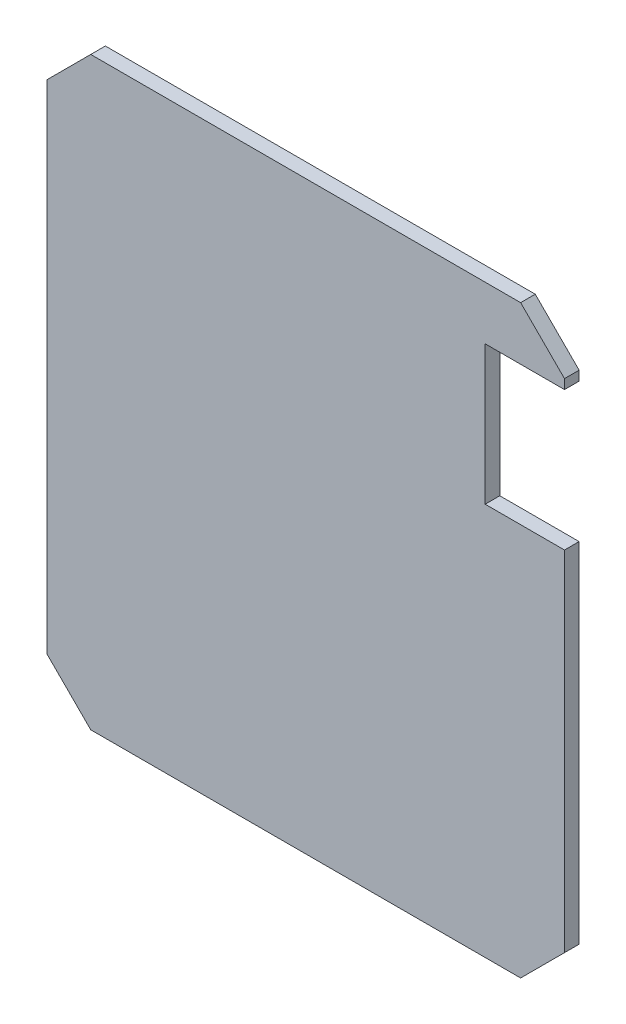
ISO-10303-21;
HEADER;
FILE_DESCRIPTION(('STEP AP214'),'2;1');
FILE_NAME('part.step','',(''),(''),'','','');
FILE_SCHEMA(('AUTOMOTIVE_DESIGN { 1 0 10303 214 1 1 1 1 }'));
ENDSEC;
DATA;
#1=APPLICATION_CONTEXT('core data for automotive mechanical design processes');
#2=APPLICATION_PROTOCOL_DEFINITION('international standard','automotive_design',2000,#1);
#3=PRODUCT_CONTEXT('',#1,'mechanical');
#4=PRODUCT('Part','Part','',(#3));
#5=PRODUCT_RELATED_PRODUCT_CATEGORY('part','',(#4));
#6=PRODUCT_DEFINITION_FORMATION('','',#4);
#7=PRODUCT_DEFINITION_CONTEXT('part definition',#1,'design');
#8=PRODUCT_DEFINITION('design','',#6,#7);
#9=PRODUCT_DEFINITION_SHAPE('','',#8);
#10=(LENGTH_UNIT() NAMED_UNIT(*) SI_UNIT(.MILLI.,.METRE.));
#11=(NAMED_UNIT(*) PLANE_ANGLE_UNIT() SI_UNIT($,.RADIAN.));
#12=(NAMED_UNIT(*) SI_UNIT($,.STERADIAN.) SOLID_ANGLE_UNIT());
#13=UNCERTAINTY_MEASURE_WITH_UNIT(LENGTH_MEASURE(1.E-05),#10,'distance_accuracy_value','');
#14=(GEOMETRIC_REPRESENTATION_CONTEXT(3) GLOBAL_UNCERTAINTY_ASSIGNED_CONTEXT((#13)) GLOBAL_UNIT_ASSIGNED_CONTEXT((#10,
#11,#12)) REPRESENTATION_CONTEXT('',''));
#15=CARTESIAN_POINT('',(0.,0.,0.));
#16=DIRECTION('',(0.,0.,1.));
#17=DIRECTION('',(1.,0.,0.));
#18=AXIS2_PLACEMENT_3D('',#15,#16,#17);
#19=CARTESIAN_POINT('',(17.7,17.,1.));
#20=DIRECTION('',(1.,0.,0.));
#21=DIRECTION('',(0.,0.,-1.));
#22=AXIS2_PLACEMENT_3D('',#19,#20,#21);
#23=PLANE('',#22);
#24=DIRECTION('',(0.,0.,1.));
#25=VECTOR('',#24,1.);
#26=CARTESIAN_POINT('',(17.7,6.84902346383944,0.));
#27=LINE('',#26,#25);
#28=CARTESIAN_POINT('',(17.7,6.84902346383944,0.));
#29=VERTEX_POINT('',#28);
#30=CARTESIAN_POINT('',(17.7,6.84902346383944,1.));
#31=VERTEX_POINT('',#30);
#32=EDGE_CURVE('E150',#29,#31,#27,.T.);
#33=ORIENTED_EDGE('',*,*,#32,.T.);
#34=DIRECTION('',(0.,-1.,0.));
#35=VECTOR('',#34,1.);
#36=CARTESIAN_POINT('',(17.7,17.,1.));
#37=LINE('',#36,#35);
#38=CARTESIAN_POINT('',(17.7,-17.,1.));
#39=VERTEX_POINT('',#38);
#40=EDGE_CURVE('E192',#31,#39,#37,.T.);
#41=ORIENTED_EDGE('',*,*,#40,.T.);
#42=DIRECTION('',(0.,0.,-1.));
#43=VECTOR('',#42,1.);
#44=CARTESIAN_POINT('',(17.7,-17.,1.));
#45=LINE('',#44,#43);
#46=CARTESIAN_POINT('',(17.7,-17.,0.));
#47=VERTEX_POINT('',#46);
#48=EDGE_CURVE('E171',#39,#47,#45,.T.);
#49=ORIENTED_EDGE('',*,*,#48,.T.);
#50=DIRECTION('',(0.,-1.,0.));
#51=VECTOR('',#50,1.);
#52=CARTESIAN_POINT('',(17.7,17.,0.));
#53=LINE('',#52,#51);
#54=EDGE_CURVE('E156',#29,#47,#53,.T.);
#55=ORIENTED_EDGE('',*,*,#54,.F.);
#56=EDGE_LOOP('',(#33,#41,#49,#55));
#57=FACE_BOUND('',#56,.T.);
#58=ADVANCED_FACE('F33',(#57),#23,.T.);
#59=CARTESIAN_POINT('',(-17.7,17.,1.));
#60=DIRECTION('',(-0.707106781186547,0.707106781186547,0.));
#61=DIRECTION('',(-0.707106781186548,-0.707106781186548,0.));
#62=AXIS2_PLACEMENT_3D('',#59,#60,#61);
#63=PLANE('',#62);
#64=DIRECTION('',(0.707106781186548,0.707106781186548,0.));
#65=VECTOR('',#64,1.);
#66=CARTESIAN_POINT('',(-17.7,17.,0.));
#67=LINE('',#66,#65);
#68=CARTESIAN_POINT('',(-17.7,17.,0.));
#69=VERTEX_POINT('',#68);
#70=CARTESIAN_POINT('',(-14.7,20.,0.));
#71=VERTEX_POINT('',#70);
#72=EDGE_CURVE('E146',#69,#71,#67,.T.);
#73=ORIENTED_EDGE('',*,*,#72,.F.);
#74=DIRECTION('',(0.,0.,-1.));
#75=VECTOR('',#74,1.);
#76=CARTESIAN_POINT('',(-17.7,17.,1.));
#77=LINE('',#76,#75);
#78=CARTESIAN_POINT('',(-17.7,17.,1.));
#79=VERTEX_POINT('',#78);
#80=EDGE_CURVE('E11',#79,#69,#77,.T.);
#81=ORIENTED_EDGE('',*,*,#80,.F.);
#82=DIRECTION('',(0.707106781186548,0.707106781186548,0.));
#83=VECTOR('',#82,1.);
#84=CARTESIAN_POINT('',(-17.7,17.,1.));
#85=LINE('',#84,#83);
#86=CARTESIAN_POINT('',(-14.7,20.,1.));
#87=VERTEX_POINT('',#86);
#88=EDGE_CURVE('E167',#79,#87,#85,.T.);
#89=ORIENTED_EDGE('',*,*,#88,.T.);
#90=DIRECTION('',(0.,0.,-1.));
#91=VECTOR('',#90,1.);
#92=CARTESIAN_POINT('',(-14.7,20.,1.));
#93=LINE('',#92,#91);
#94=EDGE_CURVE('E37',#87,#71,#93,.T.);
#95=ORIENTED_EDGE('',*,*,#94,.T.);
#96=EDGE_LOOP('',(#73,#81,#89,#95));
#97=FACE_BOUND('',#96,.T.);
#98=ADVANCED_FACE('F35',(#97),#63,.T.);
#99=CARTESIAN_POINT('',(-17.7,17.,1.));
#100=DIRECTION('',(1.,0.,0.));
#101=DIRECTION('',(0.,0.,-1.));
#102=AXIS2_PLACEMENT_3D('',#99,#100,#101);
#103=PLANE('',#102);
#104=DIRECTION('',(0.,-1.,0.));
#105=VECTOR('',#104,1.);
#106=CARTESIAN_POINT('',(-17.7,17.,0.));
#107=LINE('',#106,#105);
#108=CARTESIAN_POINT('',(-17.7,-17.,0.));
#109=VERTEX_POINT('',#108);
#110=EDGE_CURVE('E166',#69,#109,#107,.T.);
#111=ORIENTED_EDGE('',*,*,#110,.T.);
#112=DIRECTION('',(0.,0.,-1.));
#113=VECTOR('',#112,1.);
#114=CARTESIAN_POINT('',(-17.7,-17.,1.));
#115=LINE('',#114,#113);
#116=CARTESIAN_POINT('',(-17.7,-17.,1.));
#117=VERTEX_POINT('',#116);
#118=EDGE_CURVE('E42',#117,#109,#115,.T.);
#119=ORIENTED_EDGE('',*,*,#118,.F.);
#120=DIRECTION('',(0.,-1.,0.));
#121=VECTOR('',#120,1.);
#122=CARTESIAN_POINT('',(-17.7,17.,1.));
#123=LINE('',#122,#121);
#124=EDGE_CURVE('E122',#79,#117,#123,.T.);
#125=ORIENTED_EDGE('',*,*,#124,.F.);
#126=ORIENTED_EDGE('',*,*,#80,.T.);
#127=EDGE_LOOP('',(#111,#119,#125,#126));
#128=FACE_BOUND('',#127,.T.);
#129=ADVANCED_FACE('F181',(#128),#103,.F.);
#130=CARTESIAN_POINT('',(-17.7,-17.,1.));
#131=DIRECTION('',(0.707106781186547,0.707106781186547,0.));
#132=DIRECTION('',(-0.707106781186548,0.707106781186548,0.));
#133=AXIS2_PLACEMENT_3D('',#130,#131,#132);
#134=PLANE('',#133);
#135=DIRECTION('',(0.707106781186548,-0.707106781186548,0.));
#136=VECTOR('',#135,1.);
#137=CARTESIAN_POINT('',(-17.7,-17.,0.));
#138=LINE('',#137,#136);
#139=CARTESIAN_POINT('',(-14.7,-20.,0.));
#140=VERTEX_POINT('',#139);
#141=EDGE_CURVE('E131',#109,#140,#138,.T.);
#142=ORIENTED_EDGE('',*,*,#141,.T.);
#143=DIRECTION('',(0.,0.,-1.));
#144=VECTOR('',#143,1.);
#145=CARTESIAN_POINT('',(-14.7,-20.,1.));
#146=LINE('',#145,#144);
#147=CARTESIAN_POINT('',(-14.7,-20.,1.));
#148=VERTEX_POINT('',#147);
#149=EDGE_CURVE('E128',#148,#140,#146,.T.);
#150=ORIENTED_EDGE('',*,*,#149,.F.);
#151=DIRECTION('',(0.707106781186548,-0.707106781186548,0.));
#152=VECTOR('',#151,1.);
#153=CARTESIAN_POINT('',(-17.7,-17.,1.));
#154=LINE('',#153,#152);
#155=EDGE_CURVE('E113',#117,#148,#154,.T.);
#156=ORIENTED_EDGE('',*,*,#155,.F.);
#157=ORIENTED_EDGE('',*,*,#118,.T.);
#158=EDGE_LOOP('',(#142,#150,#156,#157));
#159=FACE_BOUND('',#158,.T.);
#160=ADVANCED_FACE('F129',(#159),#134,.F.);
#161=CARTESIAN_POINT('',(-14.7,-20.,1.));
#162=DIRECTION('',(0.,1.,0.));
#163=DIRECTION('',(0.,0.,1.));
#164=AXIS2_PLACEMENT_3D('',#161,#162,#163);
#165=PLANE('',#164);
#166=DIRECTION('',(1.,0.,0.));
#167=VECTOR('',#166,1.);
#168=CARTESIAN_POINT('',(-14.7,-20.,0.));
#169=LINE('',#168,#167);
#170=CARTESIAN_POINT('',(14.7,-20.,0.));
#171=VERTEX_POINT('',#170);
#172=EDGE_CURVE('E163',#140,#171,#169,.T.);
#173=ORIENTED_EDGE('',*,*,#172,.T.);
#174=DIRECTION('',(0.,0.,-1.));
#175=VECTOR('',#174,1.);
#176=CARTESIAN_POINT('',(14.7,-20.,1.));
#177=LINE('',#176,#175);
#178=CARTESIAN_POINT('',(14.7,-20.,1.));
#179=VERTEX_POINT('',#178);
#180=EDGE_CURVE('E134',#179,#171,#177,.T.);
#181=ORIENTED_EDGE('',*,*,#180,.F.);
#182=DIRECTION('',(1.,0.,0.));
#183=VECTOR('',#182,1.);
#184=CARTESIAN_POINT('',(-14.7,-20.,1.));
#185=LINE('',#184,#183);
#186=EDGE_CURVE('E119',#148,#179,#185,.T.);
#187=ORIENTED_EDGE('',*,*,#186,.F.);
#188=ORIENTED_EDGE('',*,*,#149,.T.);
#189=EDGE_LOOP('',(#173,#181,#187,#188));
#190=FACE_BOUND('',#189,.T.);
#191=ADVANCED_FACE('F136',(#190),#165,.F.);
#192=CARTESIAN_POINT('',(14.7,-20.,1.));
#193=DIRECTION('',(-0.707106781186547,0.707106781186547,0.));
#194=DIRECTION('',(-0.707106781186548,-0.707106781186548,0.));
#195=AXIS2_PLACEMENT_3D('',#192,#193,#194);
#196=PLANE('',#195);
#197=DIRECTION('',(0.707106781186548,0.707106781186548,0.));
#198=VECTOR('',#197,1.);
#199=CARTESIAN_POINT('',(14.7,-20.,0.));
#200=LINE('',#199,#198);
#201=EDGE_CURVE('E160',#171,#47,#200,.T.);
#202=ORIENTED_EDGE('',*,*,#201,.T.);
#203=ORIENTED_EDGE('',*,*,#48,.F.);
#204=DIRECTION('',(0.707106781186548,0.707106781186548,0.));
#205=VECTOR('',#204,1.);
#206=CARTESIAN_POINT('',(14.7,-20.,1.));
#207=LINE('',#206,#205);
#208=EDGE_CURVE('E139',#179,#39,#207,.T.);
#209=ORIENTED_EDGE('',*,*,#208,.F.);
#210=ORIENTED_EDGE('',*,*,#180,.T.);
#211=EDGE_LOOP('',(#202,#203,#209,#210));
#212=FACE_BOUND('',#211,.T.);
#213=ADVANCED_FACE('F205',(#212),#196,.F.);
#214=DIRECTION('',(0.,0.,1.));
#215=VECTOR('',#214,1.);
#216=CARTESIAN_POINT('',(17.7,16.3490232722534,0.));
#217=LINE('',#216,#215);
#218=CARTESIAN_POINT('',(17.7,16.3490232722534,0.));
#219=VERTEX_POINT('',#218);
#220=CARTESIAN_POINT('',(17.7,16.3490232722534,1.));
#221=VERTEX_POINT('',#220);
#222=EDGE_CURVE('E188',#219,#221,#217,.T.);
#223=ORIENTED_EDGE('',*,*,#222,.F.);
#224=CARTESIAN_POINT('',(17.7,17.,0.));
#225=VERTEX_POINT('',#224);
#226=EDGE_CURVE('E157',#225,#219,#53,.T.);
#227=ORIENTED_EDGE('',*,*,#226,.F.);
#228=DIRECTION('',(0.,0.,-1.));
#229=VECTOR('',#228,1.);
#230=CARTESIAN_POINT('',(17.7,17.,1.));
#231=LINE('',#230,#229);
#232=CARTESIAN_POINT('',(17.7,17.,1.));
#233=VERTEX_POINT('',#232);
#234=EDGE_CURVE('E174',#233,#225,#231,.T.);
#235=ORIENTED_EDGE('',*,*,#234,.F.);
#236=EDGE_CURVE('E141',#233,#221,#37,.T.);
#237=ORIENTED_EDGE('',*,*,#236,.T.);
#238=EDGE_LOOP('',(#223,#227,#235,#237));
#239=FACE_BOUND('',#238,.T.);
#240=ADVANCED_FACE('F235',(#239),#23,.T.);
#241=CARTESIAN_POINT('',(14.7,20.,1.));
#242=DIRECTION('',(0.707106781186547,0.707106781186547,0.));
#243=DIRECTION('',(-0.707106781186548,0.707106781186548,0.));
#244=AXIS2_PLACEMENT_3D('',#241,#242,#243);
#245=PLANE('',#244);
#246=DIRECTION('',(0.707106781186548,-0.707106781186548,0.));
#247=VECTOR('',#246,1.);
#248=CARTESIAN_POINT('',(14.7,20.,0.));
#249=LINE('',#248,#247);
#250=CARTESIAN_POINT('',(14.7,20.,0.));
#251=VERTEX_POINT('',#250);
#252=EDGE_CURVE('E153',#251,#225,#249,.T.);
#253=ORIENTED_EDGE('',*,*,#252,.F.);
#254=DIRECTION('',(0.,0.,-1.));
#255=VECTOR('',#254,1.);
#256=CARTESIAN_POINT('',(14.7,20.,1.));
#257=LINE('',#256,#255);
#258=CARTESIAN_POINT('',(14.7,20.,1.));
#259=VERTEX_POINT('',#258);
#260=EDGE_CURVE('E175',#259,#251,#257,.T.);
#261=ORIENTED_EDGE('',*,*,#260,.F.);
#262=DIRECTION('',(0.707106781186548,-0.707106781186548,0.));
#263=VECTOR('',#262,1.);
#264=CARTESIAN_POINT('',(14.7,20.,1.));
#265=LINE('',#264,#263);
#266=EDGE_CURVE('E185',#259,#233,#265,.T.);
#267=ORIENTED_EDGE('',*,*,#266,.T.);
#268=ORIENTED_EDGE('',*,*,#234,.T.);
#269=EDGE_LOOP('',(#253,#261,#267,#268));
#270=FACE_BOUND('',#269,.T.);
#271=ADVANCED_FACE('F237',(#270),#245,.T.);
#272=CARTESIAN_POINT('',(-14.7,20.,1.));
#273=DIRECTION('',(0.,1.,0.));
#274=DIRECTION('',(0.,0.,1.));
#275=AXIS2_PLACEMENT_3D('',#272,#273,#274);
#276=PLANE('',#275);
#277=DIRECTION('',(1.,0.,0.));
#278=VECTOR('',#277,1.);
#279=CARTESIAN_POINT('',(-14.7,20.,0.));
#280=LINE('',#279,#278);
#281=EDGE_CURVE('E149',#71,#251,#280,.T.);
#282=ORIENTED_EDGE('',*,*,#281,.F.);
#283=ORIENTED_EDGE('',*,*,#94,.F.);
#284=DIRECTION('',(1.,0.,0.));
#285=VECTOR('',#284,1.);
#286=CARTESIAN_POINT('',(-14.7,20.,1.));
#287=LINE('',#286,#285);
#288=EDGE_CURVE('E183',#87,#259,#287,.T.);
#289=ORIENTED_EDGE('',*,*,#288,.T.);
#290=ORIENTED_EDGE('',*,*,#260,.T.);
#291=EDGE_LOOP('',(#282,#283,#289,#290));
#292=FACE_BOUND('',#291,.T.);
#293=ADVANCED_FACE('F177',(#292),#276,.T.);
#294=CARTESIAN_POINT('',(0.,0.,1.));
#295=DIRECTION('',(0.,0.,-1.));
#296=DIRECTION('',(-1.,0.,0.));
#297=AXIS2_PLACEMENT_3D('',#294,#295,#296);
#298=PLANE('',#297);
#299=ORIENTED_EDGE('',*,*,#40,.F.);
#300=DIRECTION('',(1.,0.,0.));
#301=VECTOR('',#300,1.);
#302=CARTESIAN_POINT('',(17.7,6.84902346383944,1.));
#303=LINE('',#302,#301);
#304=CARTESIAN_POINT('',(12.274719434341,6.84902346383944,1.));
#305=VERTEX_POINT('',#304);
#306=EDGE_CURVE('E224',#305,#31,#303,.T.);
#307=ORIENTED_EDGE('',*,*,#306,.F.);
#308=DIRECTION('',(0.,-1.,0.));
#309=VECTOR('',#308,1.);
#310=CARTESIAN_POINT('',(12.274719434341,16.3490232722534,1.));
#311=LINE('',#310,#309);
#312=CARTESIAN_POINT('',(12.274719434341,16.3490232722534,1.));
#313=VERTEX_POINT('',#312);
#314=EDGE_CURVE('E240',#313,#305,#311,.T.);
#315=ORIENTED_EDGE('',*,*,#314,.F.);
#316=DIRECTION('',(-1.,0.,0.));
#317=VECTOR('',#316,1.);
#318=CARTESIAN_POINT('',(17.7,16.3490232722534,1.));
#319=LINE('',#318,#317);
#320=EDGE_CURVE('E239',#221,#313,#319,.T.);
#321=ORIENTED_EDGE('',*,*,#320,.F.);
#322=ORIENTED_EDGE('',*,*,#236,.F.);
#323=ORIENTED_EDGE('',*,*,#266,.F.);
#324=ORIENTED_EDGE('',*,*,#288,.F.);
#325=ORIENTED_EDGE('',*,*,#88,.F.);
#326=ORIENTED_EDGE('',*,*,#124,.T.);
#327=ORIENTED_EDGE('',*,*,#155,.T.);
#328=ORIENTED_EDGE('',*,*,#186,.T.);
#329=ORIENTED_EDGE('',*,*,#208,.T.);
#330=EDGE_LOOP('',(#299,#307,#315,#321,#322,#323,#324,#325,#326,#327,#328,#329));
#331=FACE_BOUND('',#330,.T.);
#332=ADVANCED_FACE('F116',(#331),#298,.F.);
#333=CARTESIAN_POINT('',(0.,0.,0.));
#334=DIRECTION('',(0.,0.,-1.));
#335=DIRECTION('',(-1.,0.,0.));
#336=AXIS2_PLACEMENT_3D('',#333,#334,#335);
#337=PLANE('',#336);
#338=DIRECTION('',(1.,0.,0.));
#339=VECTOR('',#338,1.);
#340=CARTESIAN_POINT('',(17.7,6.84902346383944,0.));
#341=LINE('',#340,#339);
#342=CARTESIAN_POINT('',(12.274719434341,6.84902346383944,0.));
#343=VERTEX_POINT('',#342);
#344=EDGE_CURVE('E208',#343,#29,#341,.T.);
#345=ORIENTED_EDGE('',*,*,#344,.T.);
#346=ORIENTED_EDGE('',*,*,#54,.T.);
#347=ORIENTED_EDGE('',*,*,#201,.F.);
#348=ORIENTED_EDGE('',*,*,#172,.F.);
#349=ORIENTED_EDGE('',*,*,#141,.F.);
#350=ORIENTED_EDGE('',*,*,#110,.F.);
#351=ORIENTED_EDGE('',*,*,#72,.T.);
#352=ORIENTED_EDGE('',*,*,#281,.T.);
#353=ORIENTED_EDGE('',*,*,#252,.T.);
#354=ORIENTED_EDGE('',*,*,#226,.T.);
#355=DIRECTION('',(-1.,0.,0.));
#356=VECTOR('',#355,1.);
#357=CARTESIAN_POINT('',(17.7,16.3490232722534,0.));
#358=LINE('',#357,#356);
#359=CARTESIAN_POINT('',(12.274719434341,16.3490232722534,0.));
#360=VERTEX_POINT('',#359);
#361=EDGE_CURVE('E228',#219,#360,#358,.T.);
#362=ORIENTED_EDGE('',*,*,#361,.T.);
#363=DIRECTION('',(0.,-1.,0.));
#364=VECTOR('',#363,1.);
#365=CARTESIAN_POINT('',(12.274719434341,16.3490232722534,0.));
#366=LINE('',#365,#364);
#367=EDGE_CURVE('E50',#360,#343,#366,.T.);
#368=ORIENTED_EDGE('',*,*,#367,.T.);
#369=EDGE_LOOP('',(#345,#346,#347,#348,#349,#350,#351,#352,#353,#354,#362,#368));
#370=FACE_BOUND('',#369,.T.);
#371=ADVANCED_FACE('F180',(#370),#337,.T.);
#372=CARTESIAN_POINT('',(17.7,6.84902346383944,0.));
#373=DIRECTION('',(0.,-1.,0.));
#374=DIRECTION('',(0.,0.,-1.));
#375=AXIS2_PLACEMENT_3D('',#372,#373,#374);
#376=PLANE('',#375);
#377=ORIENTED_EDGE('',*,*,#306,.T.);
#378=ORIENTED_EDGE('',*,*,#32,.F.);
#379=ORIENTED_EDGE('',*,*,#344,.F.);
#380=DIRECTION('',(0.,0.,1.));
#381=VECTOR('',#380,1.);
#382=CARTESIAN_POINT('',(12.274719434341,6.84902346383944,0.));
#383=LINE('',#382,#381);
#384=EDGE_CURVE('E222',#343,#305,#383,.T.);
#385=ORIENTED_EDGE('',*,*,#384,.T.);
#386=EDGE_LOOP('',(#377,#378,#379,#385));
#387=FACE_BOUND('',#386,.T.);
#388=ADVANCED_FACE('F249',(#387),#376,.F.);
#389=CARTESIAN_POINT('',(12.274719434341,16.3490232722534,0.));
#390=DIRECTION('',(-1.,0.,0.));
#391=DIRECTION('',(0.,0.,1.));
#392=AXIS2_PLACEMENT_3D('',#389,#390,#391);
#393=PLANE('',#392);
#394=ORIENTED_EDGE('',*,*,#314,.T.);
#395=ORIENTED_EDGE('',*,*,#384,.F.);
#396=ORIENTED_EDGE('',*,*,#367,.F.);
#397=DIRECTION('',(0.,0.,1.));
#398=VECTOR('',#397,1.);
#399=CARTESIAN_POINT('',(12.274719434341,16.3490232722534,0.));
#400=LINE('',#399,#398);
#401=EDGE_CURVE('E232',#360,#313,#400,.T.);
#402=ORIENTED_EDGE('',*,*,#401,.T.);
#403=EDGE_LOOP('',(#394,#395,#396,#402));
#404=FACE_BOUND('',#403,.T.);
#405=ADVANCED_FACE('F248',(#404),#393,.F.);
#406=CARTESIAN_POINT('',(17.7,16.3490232722534,0.));
#407=DIRECTION('',(0.,1.,0.));
#408=DIRECTION('',(0.,0.,1.));
#409=AXIS2_PLACEMENT_3D('',#406,#407,#408);
#410=PLANE('',#409);
#411=ORIENTED_EDGE('',*,*,#320,.T.);
#412=ORIENTED_EDGE('',*,*,#401,.F.);
#413=ORIENTED_EDGE('',*,*,#361,.F.);
#414=ORIENTED_EDGE('',*,*,#222,.T.);
#415=EDGE_LOOP('',(#411,#412,#413,#414));
#416=FACE_BOUND('',#415,.T.);
#417=ADVANCED_FACE('F230',(#416),#410,.F.);
#418=CLOSED_SHELL('',(#58,#98,#129,#160,#191,#213,#240,#271,#293,#332,#371,#388,#405,#417));
#419=MANIFOLD_SOLID_BREP('B2',#418);
#420=ADVANCED_BREP_SHAPE_REPRESENTATION('',(#18,#419),#14);
#421=SHAPE_DEFINITION_REPRESENTATION(#9,#420);
ENDSEC;
END-ISO-10303-21;
